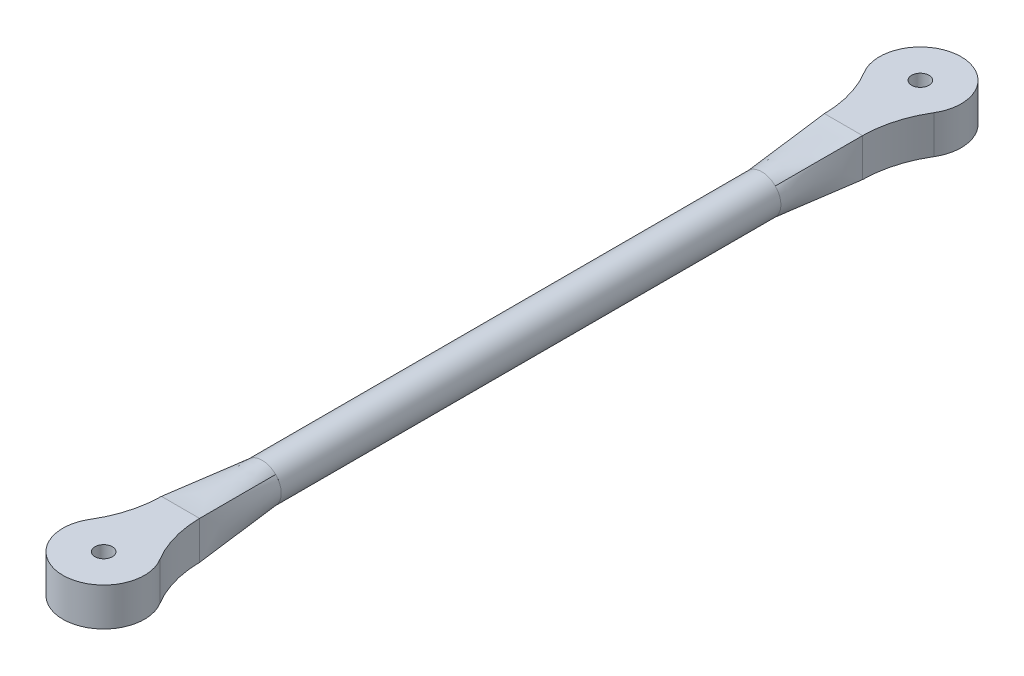
ISO-10303-21;
HEADER;
FILE_DESCRIPTION(('STEP AP214'),'2;1');
FILE_NAME('part.step','',(''),(''),'','','');
FILE_SCHEMA(('AUTOMOTIVE_DESIGN { 1 0 10303 214 1 1 1 1 }'));
ENDSEC;
DATA;
#1=APPLICATION_CONTEXT('core data for automotive mechanical design processes');
#2=APPLICATION_PROTOCOL_DEFINITION('international standard','automotive_design',2000,#1);
#3=PRODUCT_CONTEXT('',#1,'mechanical');
#4=PRODUCT('Part','Part','',(#3));
#5=PRODUCT_RELATED_PRODUCT_CATEGORY('part','',(#4));
#6=PRODUCT_DEFINITION_FORMATION('','',#4);
#7=PRODUCT_DEFINITION_CONTEXT('part definition',#1,'design');
#8=PRODUCT_DEFINITION('design','',#6,#7);
#9=PRODUCT_DEFINITION_SHAPE('','',#8);
#10=(LENGTH_UNIT() NAMED_UNIT(*) SI_UNIT(.MILLI.,.METRE.));
#11=(NAMED_UNIT(*) PLANE_ANGLE_UNIT() SI_UNIT($,.RADIAN.));
#12=(NAMED_UNIT(*) SI_UNIT($,.STERADIAN.) SOLID_ANGLE_UNIT());
#13=UNCERTAINTY_MEASURE_WITH_UNIT(LENGTH_MEASURE(1.E-05),#10,'distance_accuracy_value','');
#14=(GEOMETRIC_REPRESENTATION_CONTEXT(3) GLOBAL_UNCERTAINTY_ASSIGNED_CONTEXT((#13)) GLOBAL_UNIT_ASSIGNED_CONTEXT((#10,
#11,#12)) REPRESENTATION_CONTEXT('',''));
#15=CARTESIAN_POINT('',(0.,0.,0.));
#16=DIRECTION('',(0.,0.,1.));
#17=DIRECTION('',(1.,0.,0.));
#18=AXIS2_PLACEMENT_3D('',#15,#16,#17);
#19=CARTESIAN_POINT('',(0.,0.,50.));
#20=DIRECTION('',(0.,0.,-1.));
#21=DIRECTION('',(-1.,0.,0.));
#22=AXIS2_PLACEMENT_3D('',#19,#20,#21);
#23=CYLINDRICAL_SURFACE('',#22,3.5);
#24=CARTESIAN_POINT('',(0.,0.,45.8908481142394));
#25=DIRECTION('',(0.,0.,-1.));
#26=DIRECTION('',(-1.,0.,0.));
#27=AXIS2_PLACEMENT_3D('',#24,#25,#26);
#28=CIRCLE('',#27,3.5);
#29=CARTESIAN_POINT('',(-3.5,0.,45.8908481142394));
#30=VERTEX_POINT('',#29);
#31=EDGE_CURVE('E13',#30,#30,#28,.F.);
#32=ORIENTED_EDGE('',*,*,#31,.F.);
#33=EDGE_LOOP('',(#32));
#34=FACE_BOUND('',#33,.T.);
#35=CARTESIAN_POINT('',(2.47514039392341,-2.47460704564759,-45.8908481142394));
#36=CARTESIAN_POINT('',(2.18347373402961,-2.76633656801098,-45.8908481142395));
#37=CARTESIAN_POINT('',(1.81562078898366,-3.02791946362918,-45.8908481142394));
#38=CARTESIAN_POINT('',(0.965009462255433,-3.39610539668184,-45.8908481142394));
#39=CARTESIAN_POINT('',(0.483322797775339,-3.5,-45.8908481142395));
#40=CARTESIAN_POINT('',(-0.483322797775338,-3.5,-45.8908481142395));
#41=CARTESIAN_POINT('',(-0.965009462255431,-3.39610539668184,-45.8908481142395));
#42=CARTESIAN_POINT('',(-1.81562078898366,-3.02791946362918,-45.8908481142395));
#43=CARTESIAN_POINT('',(-2.18347373402961,-2.76633656801098,-45.8908481142395));
#44=CARTESIAN_POINT('',(-2.47514039392341,-2.47460704564759,-45.8908481142394));
#45=B_SPLINE_CURVE_WITH_KNOTS('',3,(#35,#36,#37,#38,#39,#40,#41,#42,#43,#44),.UNSPECIFIED.,.F.,
.F.,(4,2,2,2,4),(0.,0.25,0.5,0.75,1.),.UNSPECIFIED.);
#46=CARTESIAN_POINT('',(-2.47514042273913,-2.47460707447812,-45.8908481142394));
#47=VERTEX_POINT('',#46);
#48=CARTESIAN_POINT('',(2.47514039392341,-2.47460704564759,-45.8908481142394));
#49=VERTEX_POINT('',#48);
#50=EDGE_CURVE('E232',#47,#49,#45,.F.);
#51=ORIENTED_EDGE('',*,*,#50,.T.);
#52=CARTESIAN_POINT('',(0.,0.,-45.8908481142394));
#53=DIRECTION('',(0.,0.,-1.));
#54=DIRECTION('',(-1.,0.,0.));
#55=AXIS2_PLACEMENT_3D('',#52,#53,#54);
#56=CIRCLE('',#55,3.5);
#57=CARTESIAN_POINT('',(2.47514039392341,2.47460704564759,-45.8908481142394));
#58=VERTEX_POINT('',#57);
#59=EDGE_CURVE('E242',#58,#49,#56,.T.);
#60=ORIENTED_EDGE('',*,*,#59,.F.);
#61=CARTESIAN_POINT('',(-2.47514039392341,2.47460704564759,-45.8908481142394));
#62=VERTEX_POINT('',#61);
#63=EDGE_CURVE('E321',#62,#58,#56,.T.);
#64=ORIENTED_EDGE('',*,*,#63,.F.);
#65=EDGE_CURVE('E226',#47,#62,#56,.T.);
#66=ORIENTED_EDGE('',*,*,#65,.F.);
#67=EDGE_LOOP('',(#51,#60,#64,#66));
#68=FACE_BOUND('',#67,.T.);
#69=ADVANCED_FACE('F131',(#34,#68),#23,.T.);
#70=CARTESIAN_POINT('',(-2.47514039392341,2.47460704564759,-45.8908481142394));
#71=CARTESIAN_POINT('',(-3.50075434965266,3.5,-60.8908481142394));
#72=CARTESIAN_POINT('',(-2.18347373402961,2.76633656801098,-45.8908481142394));
#73=CARTESIAN_POINT('',(-2.91729529137722,3.5,-60.8908481142394));
#74=CARTESIAN_POINT('',(-1.81562078898366,3.02791946362918,-45.8908481142395));
#75=CARTESIAN_POINT('',(-2.33383623310177,3.5,-60.8908481142394));
#76=CARTESIAN_POINT('',(-0.965009462255432,3.39610539668184,-45.8908481142394));
#77=CARTESIAN_POINT('',(-1.16691811655089,3.5,-60.8908481142394));
#78=CARTESIAN_POINT('',(-0.483322797775338,3.5,-45.8908481142394));
#79=CARTESIAN_POINT('',(-0.583459058275443,3.5,-60.8908481142394));
#80=CARTESIAN_POINT('',(0.483322797775338,3.5,-45.8908481142395));
#81=CARTESIAN_POINT('',(0.583459058275444,3.5,-60.8908481142394));
#82=CARTESIAN_POINT('',(0.965009462255431,3.39610539668184,-45.8908481142394));
#83=CARTESIAN_POINT('',(1.16691811655089,3.5,-60.8908481142394));
#84=CARTESIAN_POINT('',(1.81562078898366,3.02791946362918,-45.8908481142395));
#85=CARTESIAN_POINT('',(2.33383623310178,3.5,-60.8908481142394));
#86=CARTESIAN_POINT('',(2.1834737340296,2.76633656801099,-45.8908481142394));
#87=CARTESIAN_POINT('',(2.91729529137722,3.5,-60.8908481142394));
#88=CARTESIAN_POINT('',(2.47514039392341,2.47460704564759,-45.8908481142394));
#89=CARTESIAN_POINT('',(3.50075434965266,3.5,-60.8908481142394));
#90=B_SPLINE_SURFACE_WITH_KNOTS('',3,1,((#70,#71),(#72,#73),(#74,#75),(#76,#77),(#78,#79),(#80,
#81),(#82,#83),(#84,#85),(#86,#87),(#88,#89)),.UNSPECIFIED.,.F.,.F.,.F.,(4,2,2,2,4),(2,2),(0.,
0.25,0.5,0.75,1.),(0.,1.),.UNSPECIFIED.);
#91=DIRECTION('',(0.0680569034764988,0.0680422384368041,-0.995358484003477));
#92=VECTOR('',#91,1.);
#93=CARTESIAN_POINT('',(2.98794737178803,2.98730352282379,-53.3908481142394));
#94=LINE('',#93,#92);
#95=CARTESIAN_POINT('',(3.50075434965266,3.5,-60.8908481142394));
#96=VERTEX_POINT('',#95);
#97=EDGE_CURVE('E318',#58,#96,#94,.T.);
#98=DIRECTION('',(-1.,0.,0.));
#99=VECTOR('',#98,1.);
#100=CARTESIAN_POINT('',(3.50075434965266,3.5,-60.8908481142394));
#101=LINE('',#100,#99);
#102=CARTESIAN_POINT('',(-3.50075434965266,3.5,-60.8908481142394));
#103=VERTEX_POINT('',#102);
#104=EDGE_CURVE('E320',#96,#103,#101,.T.);
#105=DIRECTION('',(0.0680569034764988,-0.0680422384368042,0.995358484003477));
#106=VECTOR('',#105,1.);
#107=CARTESIAN_POINT('',(-2.98794737178803,2.98730352282379,-53.3908481142394));
#108=LINE('',#107,#106);
#109=EDGE_CURVE('E225',#103,#62,#108,.T.);
#110=ORIENTED_EDGE('',*,*,#63,.T.);
#111=ORIENTED_EDGE('',*,*,#97,.T.);
#112=ORIENTED_EDGE('',*,*,#104,.T.);
#113=ORIENTED_EDGE('',*,*,#109,.T.);
#114=EDGE_LOOP('',(#110,#111,#112,#113));
#115=FACE_BOUND('',#114,.T.);
#116=ADVANCED_FACE('F326',(#115),#90,.T.);
#117=CARTESIAN_POINT('',(2.47514039392341,2.47460704564759,-45.8908481142394));
#118=CARTESIAN_POINT('',(3.50075434965266,3.5,-60.8908481142394));
#119=CARTESIAN_POINT('',(2.76674420489334,2.18294038575379,-45.8908481142395));
#120=CARTESIAN_POINT('',(3.50075434965266,2.91666666666667,-60.8908481142394));
#121=CARTESIAN_POINT('',(3.02819068787414,1.81513530449393,-45.8908481142395));
#122=CARTESIAN_POINT('',(3.50075434965266,2.33333333333333,-60.8908481142394));
#123=CARTESIAN_POINT('',(3.39617071487054,0.964717311549674,-45.8908481142394));
#124=CARTESIAN_POINT('',(3.50075434965266,1.16666666666667,-60.8908481142394));
#125=CARTESIAN_POINT('',(3.5,0.483175517715297,-45.8908481142395));
#126=CARTESIAN_POINT('',(3.50075434965266,0.583333333333335,-60.8908481142394));
#127=CARTESIAN_POINT('',(3.5,-0.483175517715295,-45.8908481142395));
#128=CARTESIAN_POINT('',(3.50075434965266,-0.583333333333332,-60.8908481142394));
#129=CARTESIAN_POINT('',(3.39617071487054,-0.964717311549672,-45.8908481142395));
#130=CARTESIAN_POINT('',(3.50075434965266,-1.16666666666667,-60.8908481142394));
#131=CARTESIAN_POINT('',(3.02819068787414,-1.81513530449392,-45.8908481142395));
#132=CARTESIAN_POINT('',(3.50075434965266,-2.33333333333333,-60.8908481142394));
#133=CARTESIAN_POINT('',(2.76674420489334,-2.18294038575379,-45.8908481142395));
#134=CARTESIAN_POINT('',(3.50075434965266,-2.91666666666667,-60.8908481142394));
#135=CARTESIAN_POINT('',(2.47514039392341,-2.47460704564759,-45.8908481142394));
#136=CARTESIAN_POINT('',(3.50075434965266,-3.5,-60.8908481142394));
#137=B_SPLINE_SURFACE_WITH_KNOTS('',3,1,((#117,#118),(#119,#120),(#121,#122),(#123,#124),(#125,
#126),(#127,#128),(#129,#130),(#131,#132),(#133,#134),(#135,#136)),.UNSPECIFIED.,.F.,.F.,.F.,(4,
2,2,2,4),(2,2),(0.,0.25,0.5,0.75,1.),(0.,1.),.UNSPECIFIED.);
#138=DIRECTION('',(0.0680569034764987,-0.0680422384368042,-0.995358484003477));
#139=VECTOR('',#138,1.);
#140=CARTESIAN_POINT('',(2.98794737178803,-2.98730352282379,-53.3908481142394));
#141=LINE('',#140,#139);
#142=CARTESIAN_POINT('',(3.50075434965266,-3.5,-60.8908481142394));
#143=VERTEX_POINT('',#142);
#144=EDGE_CURVE('E240',#49,#143,#141,.T.);
#145=DIRECTION('',(0.,1.,0.));
#146=VECTOR('',#145,1.);
#147=CARTESIAN_POINT('',(3.50075434965266,-3.5,-60.8908481142394));
#148=LINE('',#147,#146);
#149=EDGE_CURVE('E164',#143,#96,#148,.T.);
#150=ORIENTED_EDGE('',*,*,#59,.T.);
#151=ORIENTED_EDGE('',*,*,#144,.T.);
#152=ORIENTED_EDGE('',*,*,#149,.T.);
#153=ORIENTED_EDGE('',*,*,#97,.F.);
#154=EDGE_LOOP('',(#150,#151,#152,#153));
#155=FACE_BOUND('',#154,.T.);
#156=ADVANCED_FACE('F278',(#155),#137,.T.);
#157=CARTESIAN_POINT('',(-2.47514039392341,-2.47460704564759,-45.8908481142394));
#158=CARTESIAN_POINT('',(-3.50075434965266,-3.5,-60.8908481142394));
#159=CARTESIAN_POINT('',(-2.76674420489334,-2.18294038575379,-45.8908481142395));
#160=CARTESIAN_POINT('',(-3.50075434965266,-2.91666666666667,-60.8908481142394));
#161=CARTESIAN_POINT('',(-3.02819068787414,-1.81513530449393,-45.8908481142395));
#162=CARTESIAN_POINT('',(-3.50075434965266,-2.33333333333333,-60.8908481142394));
#163=CARTESIAN_POINT('',(-3.39617071487054,-0.964717311549673,-45.8908481142394));
#164=CARTESIAN_POINT('',(-3.50075434965266,-1.16666666666667,-60.8908481142394));
#165=CARTESIAN_POINT('',(-3.5,-0.483175517715296,-45.8908481142395));
#166=CARTESIAN_POINT('',(-3.50075434965266,-0.583333333333333,-60.8908481142394));
#167=CARTESIAN_POINT('',(-3.5,0.483175517715296,-45.8908481142395));
#168=CARTESIAN_POINT('',(-3.50075434965266,0.583333333333334,-60.8908481142394));
#169=CARTESIAN_POINT('',(-3.39617071487054,0.964717311549672,-45.8908481142395));
#170=CARTESIAN_POINT('',(-3.50075434965266,1.16666666666667,-60.8908481142394));
#171=CARTESIAN_POINT('',(-3.02819068787414,1.81513530449393,-45.8908481142395));
#172=CARTESIAN_POINT('',(-3.50075434965266,2.33333333333333,-60.8908481142394));
#173=CARTESIAN_POINT('',(-2.76674420489334,2.18294038575379,-45.8908481142395));
#174=CARTESIAN_POINT('',(-3.50075434965266,2.91666666666667,-60.8908481142394));
#175=CARTESIAN_POINT('',(-2.47514039392341,2.47460704564759,-45.8908481142394));
#176=CARTESIAN_POINT('',(-3.50075434965266,3.5,-60.8908481142394));
#177=B_SPLINE_SURFACE_WITH_KNOTS('',3,1,((#157,#158),(#159,#160),(#161,#162),(#163,#164),(#165,
#166),(#167,#168),(#169,#170),(#171,#172),(#173,#174),(#175,#176)),.UNSPECIFIED.,.F.,.F.,.F.,(4,
2,2,2,4),(2,2),(0.,0.25,0.5,0.75,1.),(0.,1.),.UNSPECIFIED.);
#178=DIRECTION('',(0.,-1.,0.));
#179=VECTOR('',#178,1.);
#180=CARTESIAN_POINT('',(-3.50075434965266,3.5,-60.8908481142394));
#181=LINE('',#180,#179);
#182=CARTESIAN_POINT('',(-3.50075434965266,-3.5,-60.8908481142394));
#183=VERTEX_POINT('',#182);
#184=EDGE_CURVE('E212',#103,#183,#181,.T.);
#185=DIRECTION('',(-0.0680569034764988,-0.0680422384368042,-0.995358484003477));
#186=VECTOR('',#185,1.);
#187=CARTESIAN_POINT('',(-2.98794737178803,-2.98730352282379,-53.3908481142394));
#188=LINE('',#187,#186);
#189=EDGE_CURVE('E205',#47,#183,#188,.T.);
#190=ORIENTED_EDGE('',*,*,#65,.T.);
#191=ORIENTED_EDGE('',*,*,#109,.F.);
#192=ORIENTED_EDGE('',*,*,#184,.T.);
#193=ORIENTED_EDGE('',*,*,#189,.F.);
#194=EDGE_LOOP('',(#190,#191,#192,#193));
#195=FACE_BOUND('',#194,.T.);
#196=ADVANCED_FACE('F222',(#195),#177,.T.);
#197=CARTESIAN_POINT('',(2.47514039392341,-2.47460704564759,-45.8908481142394));
#198=CARTESIAN_POINT('',(3.50075434965266,-3.5,-60.8908481142394));
#199=CARTESIAN_POINT('',(2.18347373402961,-2.76633656801098,-45.8908481142395));
#200=CARTESIAN_POINT('',(2.91729529137722,-3.5,-60.8908481142394));
#201=CARTESIAN_POINT('',(1.81562078898366,-3.02791946362918,-45.8908481142394));
#202=CARTESIAN_POINT('',(2.33383623310178,-3.5,-60.8908481142394));
#203=CARTESIAN_POINT('',(0.965009462255433,-3.39610539668184,-45.8908481142394));
#204=CARTESIAN_POINT('',(1.16691811655089,-3.5,-60.8908481142394));
#205=CARTESIAN_POINT('',(0.483322797775339,-3.5,-45.8908481142395));
#206=CARTESIAN_POINT('',(0.583459058275445,-3.5,-60.8908481142394));
#207=CARTESIAN_POINT('',(-0.483322797775338,-3.5,-45.8908481142395));
#208=CARTESIAN_POINT('',(-0.583459058275443,-3.5,-60.8908481142394));
#209=CARTESIAN_POINT('',(-0.965009462255431,-3.39610539668184,-45.8908481142395));
#210=CARTESIAN_POINT('',(-1.16691811655089,-3.5,-60.8908481142394));
#211=CARTESIAN_POINT('',(-1.81562078898366,-3.02791946362918,-45.8908481142395));
#212=CARTESIAN_POINT('',(-2.33383623310177,-3.5,-60.8908481142394));
#213=CARTESIAN_POINT('',(-2.18347373402961,-2.76633656801098,-45.8908481142395));
#214=CARTESIAN_POINT('',(-2.91729529137722,-3.5,-60.8908481142394));
#215=CARTESIAN_POINT('',(-2.47514039392341,-2.47460704564759,-45.8908481142394));
#216=CARTESIAN_POINT('',(-3.50075434965266,-3.5,-60.8908481142394));
#217=B_SPLINE_SURFACE_WITH_KNOTS('',3,1,((#197,#198),(#199,#200),(#201,#202),(#203,#204),(#205,
#206),(#207,#208),(#209,#210),(#211,#212),(#213,#214),(#215,#216)),.UNSPECIFIED.,.F.,.F.,.F.,(4,
2,2,2,4),(2,2),(0.,0.25,0.5,0.75,1.),(0.,1.),.UNSPECIFIED.);
#218=DIRECTION('',(1.,0.,0.));
#219=VECTOR('',#218,1.);
#220=CARTESIAN_POINT('',(-3.50075434965266,-3.5,-60.8908481142394));
#221=LINE('',#220,#219);
#222=EDGE_CURVE('E193',#183,#143,#221,.T.);
#223=ORIENTED_EDGE('',*,*,#50,.F.);
#224=ORIENTED_EDGE('',*,*,#189,.T.);
#225=ORIENTED_EDGE('',*,*,#222,.T.);
#226=ORIENTED_EDGE('',*,*,#144,.F.);
#227=EDGE_LOOP('',(#223,#224,#225,#226));
#228=FACE_BOUND('',#227,.T.);
#229=ADVANCED_FACE('F230',(#228),#217,.T.);
#230=CARTESIAN_POINT('',(0.,3.5,-75.));
#231=DIRECTION('',(0.,-1.,0.));
#232=DIRECTION('',(0.,0.,-1.));
#233=AXIS2_PLACEMENT_3D('',#230,#231,#232);
#234=CYLINDRICAL_SURFACE('',#233,1.6);
#235=CARTESIAN_POINT('',(0.,3.5,-75.));
#236=DIRECTION('',(0.,1.,0.));
#237=DIRECTION('',(0.,0.,1.));
#238=AXIS2_PLACEMENT_3D('',#235,#236,#237);
#239=CIRCLE('',#238,1.6);
#240=CARTESIAN_POINT('',(0.,3.5,-73.4));
#241=VERTEX_POINT('',#240);
#242=EDGE_CURVE('E204',#241,#241,#239,.T.);
#243=ORIENTED_EDGE('',*,*,#242,.T.);
#244=EDGE_LOOP('',(#243));
#245=FACE_BOUND('',#244,.T.);
#246=CARTESIAN_POINT('',(0.,-3.5,-75.));
#247=DIRECTION('',(0.,1.,0.));
#248=DIRECTION('',(0.,0.,1.));
#249=AXIS2_PLACEMENT_3D('',#246,#247,#248);
#250=CIRCLE('',#249,1.6);
#251=CARTESIAN_POINT('',(0.,-3.5,-73.4));
#252=VERTEX_POINT('',#251);
#253=EDGE_CURVE('E216',#252,#252,#250,.T.);
#254=ORIENTED_EDGE('',*,*,#253,.F.);
#255=EDGE_LOOP('',(#254));
#256=FACE_BOUND('',#255,.T.);
#257=ADVANCED_FACE('F258',(#245,#256),#234,.F.);
#258=CARTESIAN_POINT('',(0.,3.5,-75.));
#259=DIRECTION('',(0.,-1.,0.));
#260=DIRECTION('',(0.,0.,-1.));
#261=AXIS2_PLACEMENT_3D('',#258,#259,#260);
#262=CYLINDRICAL_SURFACE('',#261,7.5);
#263=CARTESIAN_POINT('',(0.,-3.5,-75.));
#264=DIRECTION('',(0.,1.,0.));
#265=DIRECTION('',(0.,0.,-1.));
#266=AXIS2_PLACEMENT_3D('',#263,#264,#265);
#267=CIRCLE('',#266,7.5);
#268=CARTESIAN_POINT('',(6.40909090909091,-3.5,-71.104675402613));
#269=VERTEX_POINT('',#268);
#270=CARTESIAN_POINT('',(-6.40909090909091,-3.5,-71.104675402613));
#271=VERTEX_POINT('',#270);
#272=EDGE_CURVE('E172',#269,#271,#267,.T.);
#273=ORIENTED_EDGE('',*,*,#272,.T.);
#274=DIRECTION('',(0.,-1.,0.));
#275=VECTOR('',#274,1.);
#276=CARTESIAN_POINT('',(-6.40909090909091,3.5,-71.104675402613));
#277=LINE('',#276,#275);
#278=CARTESIAN_POINT('',(-6.40909090909091,3.5,-71.104675402613));
#279=VERTEX_POINT('',#278);
#280=EDGE_CURVE('E215',#279,#271,#277,.T.);
#281=ORIENTED_EDGE('',*,*,#280,.F.);
#282=CARTESIAN_POINT('',(0.,3.5,-75.));
#283=DIRECTION('',(0.,1.,0.));
#284=DIRECTION('',(0.,0.,-1.));
#285=AXIS2_PLACEMENT_3D('',#282,#283,#284);
#286=CIRCLE('',#285,7.5);
#287=CARTESIAN_POINT('',(6.40909090909091,3.5,-71.104675402613));
#288=VERTEX_POINT('',#287);
#289=EDGE_CURVE('E140',#288,#279,#286,.T.);
#290=ORIENTED_EDGE('',*,*,#289,.F.);
#291=DIRECTION('',(0.,-1.,0.));
#292=VECTOR('',#291,1.);
#293=CARTESIAN_POINT('',(6.40909090909091,3.5,-71.104675402613));
#294=LINE('',#293,#292);
#295=EDGE_CURVE('E410',#288,#269,#294,.T.);
#296=ORIENTED_EDGE('',*,*,#295,.T.);
#297=EDGE_LOOP('',(#273,#281,#290,#296));
#298=FACE_BOUND('',#297,.T.);
#299=ADVANCED_FACE('F456',(#298),#262,.T.);
#300=CARTESIAN_POINT('',(23.5,3.5,-60.7171431429143));
#301=DIRECTION('',(0.,-1.,0.));
#302=DIRECTION('',(0.,0.,-1.));
#303=AXIS2_PLACEMENT_3D('',#300,#301,#302);
#304=CYLINDRICAL_SURFACE('',#303,20.);
#305=ORIENTED_EDGE('',*,*,#149,.F.);
#306=CARTESIAN_POINT('',(23.5,-3.5,-60.7171431429143));
#307=DIRECTION('',(0.,-1.,0.));
#308=DIRECTION('',(0.,0.,1.));
#309=AXIS2_PLACEMENT_3D('',#306,#307,#308);
#310=CIRCLE('',#309,20.);
#311=EDGE_CURVE('E198',#143,#269,#310,.T.);
#312=ORIENTED_EDGE('',*,*,#311,.T.);
#313=ORIENTED_EDGE('',*,*,#295,.F.);
#314=CARTESIAN_POINT('',(23.5,3.5,-60.7171431429143));
#315=DIRECTION('',(0.,-1.,0.));
#316=DIRECTION('',(0.,0.,1.));
#317=AXIS2_PLACEMENT_3D('',#314,#315,#316);
#318=CIRCLE('',#317,20.);
#319=EDGE_CURVE('E395',#96,#288,#318,.T.);
#320=ORIENTED_EDGE('',*,*,#319,.F.);
#321=EDGE_LOOP('',(#305,#312,#313,#320));
#322=FACE_BOUND('',#321,.T.);
#323=ADVANCED_FACE('F338',(#322),#304,.F.);
#324=CARTESIAN_POINT('',(-23.5,3.5,-60.7171431429143));
#325=DIRECTION('',(0.,-1.,0.));
#326=DIRECTION('',(0.,0.,-1.));
#327=AXIS2_PLACEMENT_3D('',#324,#325,#326);
#328=CYLINDRICAL_SURFACE('',#327,20.);
#329=ORIENTED_EDGE('',*,*,#184,.F.);
#330=CARTESIAN_POINT('',(-23.5,3.5,-60.7171431429143));
#331=DIRECTION('',(0.,-1.,0.));
#332=DIRECTION('',(0.,0.,1.));
#333=AXIS2_PLACEMENT_3D('',#330,#331,#332);
#334=CIRCLE('',#333,20.);
#335=EDGE_CURVE('E187',#279,#103,#334,.T.);
#336=ORIENTED_EDGE('',*,*,#335,.F.);
#337=ORIENTED_EDGE('',*,*,#280,.T.);
#338=CARTESIAN_POINT('',(-23.5,-3.5,-60.7171431429143));
#339=DIRECTION('',(0.,-1.,0.));
#340=DIRECTION('',(0.,0.,1.));
#341=AXIS2_PLACEMENT_3D('',#338,#339,#340);
#342=CIRCLE('',#341,20.);
#343=EDGE_CURVE('E197',#271,#183,#342,.T.);
#344=ORIENTED_EDGE('',*,*,#343,.T.);
#345=EDGE_LOOP('',(#329,#336,#337,#344));
#346=FACE_BOUND('',#345,.T.);
#347=ADVANCED_FACE('F211',(#346),#328,.F.);
#348=CARTESIAN_POINT('',(23.5,-3.5,-60.7171431429143));
#349=DIRECTION('',(0.,1.,0.));
#350=DIRECTION('',(0.,0.,1.));
#351=AXIS2_PLACEMENT_3D('',#348,#349,#350);
#352=PLANE('',#351);
#353=ORIENTED_EDGE('',*,*,#253,.T.);
#354=EDGE_LOOP('',(#353));
#355=FACE_BOUND('',#354,.T.);
#356=ORIENTED_EDGE('',*,*,#222,.F.);
#357=ORIENTED_EDGE('',*,*,#343,.F.);
#358=ORIENTED_EDGE('',*,*,#272,.F.);
#359=ORIENTED_EDGE('',*,*,#311,.F.);
#360=EDGE_LOOP('',(#356,#357,#358,#359));
#361=FACE_BOUND('',#360,.T.);
#362=ADVANCED_FACE('F196',(#355,#361),#352,.F.);
#363=CARTESIAN_POINT('',(23.5,3.5,-60.7171431429143));
#364=DIRECTION('',(0.,1.,0.));
#365=DIRECTION('',(0.,0.,1.));
#366=AXIS2_PLACEMENT_3D('',#363,#364,#365);
#367=PLANE('',#366);
#368=ORIENTED_EDGE('',*,*,#242,.F.);
#369=EDGE_LOOP('',(#368));
#370=FACE_BOUND('',#369,.T.);
#371=ORIENTED_EDGE('',*,*,#335,.T.);
#372=ORIENTED_EDGE('',*,*,#104,.F.);
#373=ORIENTED_EDGE('',*,*,#319,.T.);
#374=ORIENTED_EDGE('',*,*,#289,.T.);
#375=EDGE_LOOP('',(#371,#372,#373,#374));
#376=FACE_BOUND('',#375,.T.);
#377=ADVANCED_FACE('F384',(#370,#376),#367,.T.);
#378=CARTESIAN_POINT('',(-9.02207098454915,3.551,45.8908481142394));
#379=DIRECTION('',(0.,0.,-1.));
#380=DIRECTION('',(-1.,0.,0.));
#381=AXIS2_PLACEMENT_3D('',#378,#379,#380);
#382=PLANE('',#381);
#383=ORIENTED_EDGE('',*,*,#31,.T.);
#384=EDGE_LOOP('',(#383));
#385=FACE_BOUND('',#384,.T.);
#386=ADVANCED_FACE('F133',(#385),#382,.F.);
#387=CLOSED_SHELL('',(#69,#116,#156,#196,#229,#257,#299,#323,#347,#362,#377,#386));
#388=MANIFOLD_SOLID_BREP('B2',#387);
#389=CARTESIAN_POINT('',(0.,3.5,75.));
#390=DIRECTION('',(0.,-1.,0.));
#391=DIRECTION('',(0.,0.,-1.));
#392=AXIS2_PLACEMENT_3D('',#389,#390,#391);
#393=CYLINDRICAL_SURFACE('',#392,1.6);
#394=CARTESIAN_POINT('',(0.,3.5,75.));
#395=DIRECTION('',(0.,1.,0.));
#396=DIRECTION('',(0.,0.,1.));
#397=AXIS2_PLACEMENT_3D('',#394,#395,#396);
#398=CIRCLE('',#397,1.6);
#399=CARTESIAN_POINT('',(0.,3.5,76.6));
#400=VERTEX_POINT('',#399);
#401=EDGE_CURVE('E129',#400,#400,#398,.T.);
#402=ORIENTED_EDGE('',*,*,#401,.T.);
#403=EDGE_LOOP('',(#402));
#404=FACE_BOUND('',#403,.T.);
#405=CARTESIAN_POINT('',(0.,-3.5,75.));
#406=DIRECTION('',(0.,1.,0.));
#407=DIRECTION('',(0.,0.,1.));
#408=AXIS2_PLACEMENT_3D('',#405,#406,#407);
#409=CIRCLE('',#408,1.6);
#410=CARTESIAN_POINT('',(0.,-3.5,76.6));
#411=VERTEX_POINT('',#410);
#412=EDGE_CURVE('E831',#411,#411,#409,.T.);
#413=ORIENTED_EDGE('',*,*,#412,.F.);
#414=EDGE_LOOP('',(#413));
#415=FACE_BOUND('',#414,.T.);
#416=ADVANCED_FACE('F564',(#404,#415),#393,.F.);
#417=CARTESIAN_POINT('',(0.,3.5,75.));
#418=DIRECTION('',(0.,-1.,0.));
#419=DIRECTION('',(0.,0.,-1.));
#420=AXIS2_PLACEMENT_3D('',#417,#418,#419);
#421=CYLINDRICAL_SURFACE('',#420,7.5);
#422=CARTESIAN_POINT('',(0.,-3.5,75.));
#423=DIRECTION('',(0.,1.,0.));
#424=DIRECTION('',(0.,0.,1.));
#425=AXIS2_PLACEMENT_3D('',#422,#423,#424);
#426=CIRCLE('',#425,7.5);
#427=CARTESIAN_POINT('',(-6.40909090909091,-3.5,71.104675402613));
#428=VERTEX_POINT('',#427);
#429=CARTESIAN_POINT('',(6.40909090909091,-3.5,71.104675402613));
#430=VERTEX_POINT('',#429);
#431=EDGE_CURVE('E592',#428,#430,#426,.T.);
#432=ORIENTED_EDGE('',*,*,#431,.T.);
#433=DIRECTION('',(0.,-1.,0.));
#434=VECTOR('',#433,1.);
#435=CARTESIAN_POINT('',(6.40909090909091,3.5,71.104675402613));
#436=LINE('',#435,#434);
#437=CARTESIAN_POINT('',(6.40909090909091,3.5,71.104675402613));
#438=VERTEX_POINT('',#437);
#439=EDGE_CURVE('E574',#438,#430,#436,.T.);
#440=ORIENTED_EDGE('',*,*,#439,.F.);
#441=CARTESIAN_POINT('',(0.,3.5,75.));
#442=DIRECTION('',(0.,1.,0.));
#443=DIRECTION('',(0.,0.,1.));
#444=AXIS2_PLACEMENT_3D('',#441,#442,#443);
#445=CIRCLE('',#444,7.5);
#446=CARTESIAN_POINT('',(-6.40909090909091,3.5,71.104675402613));
#447=VERTEX_POINT('',#446);
#448=EDGE_CURVE('E813',#447,#438,#445,.T.);
#449=ORIENTED_EDGE('',*,*,#448,.F.);
#450=DIRECTION('',(0.,-1.,0.));
#451=VECTOR('',#450,1.);
#452=CARTESIAN_POINT('',(-6.40909090909091,3.5,71.104675402613));
#453=LINE('',#452,#451);
#454=EDGE_CURVE('E824',#447,#428,#453,.T.);
#455=ORIENTED_EDGE('',*,*,#454,.T.);
#456=EDGE_LOOP('',(#432,#440,#449,#455));
#457=FACE_BOUND('',#456,.T.);
#458=ADVANCED_FACE('F828',(#457),#421,.T.);
#459=CARTESIAN_POINT('',(-23.5,3.5,60.7171431429143));
#460=DIRECTION('',(0.,-1.,0.));
#461=DIRECTION('',(0.,0.,-1.));
#462=AXIS2_PLACEMENT_3D('',#459,#460,#461);
#463=CYLINDRICAL_SURFACE('',#462,20.);
#464=CARTESIAN_POINT('',(-23.5,3.5,60.7171431429143));
#465=DIRECTION('',(0.,-1.,0.));
#466=DIRECTION('',(0.,0.,-1.));
#467=AXIS2_PLACEMENT_3D('',#464,#465,#466);
#468=CIRCLE('',#467,20.);
#469=CARTESIAN_POINT('',(-3.50075434965266,3.5,60.8908481142394));
#470=VERTEX_POINT('',#469);
#471=EDGE_CURVE('E607',#470,#447,#468,.T.);
#472=ORIENTED_EDGE('',*,*,#471,.F.);
#473=CARTESIAN_POINT('',(-3.50075434965266,-3.5,60.8908481142394));
#474=CARTESIAN_POINT('',(-3.50075434965266,-2.91666666666667,60.8908481142394));
#475=CARTESIAN_POINT('',(-3.50075434965266,-2.33333333333333,60.8908481142394));
#476=CARTESIAN_POINT('',(-3.50075434965266,-1.16666666666667,60.8908481142394));
#477=CARTESIAN_POINT('',(-3.50075434965266,-0.583333333333333,60.8908481142394));
#478=CARTESIAN_POINT('',(-3.50075434965266,0.583333333333334,60.8908481142394));
#479=CARTESIAN_POINT('',(-3.50075434965266,1.16666666666667,60.8908481142394));
#480=CARTESIAN_POINT('',(-3.50075434965266,2.33333333333333,60.8908481142394));
#481=CARTESIAN_POINT('',(-3.50075434965266,2.91666666666667,60.8908481142394));
#482=CARTESIAN_POINT('',(-3.50075434965266,3.5,60.8908481142394));
#483=B_SPLINE_CURVE_WITH_KNOTS('',3,(#473,#474,#475,#476,#477,#478,#479,#480,#481,#482),
.UNSPECIFIED.,.F.,.F.,(4,2,2,2,4),(0.,0.25,0.5,0.75,1.),.UNSPECIFIED.);
#484=CARTESIAN_POINT('',(-3.50075434965266,-3.5,60.8908481142394));
#485=VERTEX_POINT('',#484);
#486=EDGE_CURVE('E712',#485,#470,#483,.T.);
#487=ORIENTED_EDGE('',*,*,#486,.F.);
#488=CARTESIAN_POINT('',(-23.5,-3.5,60.7171431429143));
#489=DIRECTION('',(0.,-1.,0.));
#490=DIRECTION('',(0.,0.,-1.));
#491=AXIS2_PLACEMENT_3D('',#488,#489,#490);
#492=CIRCLE('',#491,20.);
#493=EDGE_CURVE('E823',#485,#428,#492,.T.);
#494=ORIENTED_EDGE('',*,*,#493,.T.);
#495=ORIENTED_EDGE('',*,*,#454,.F.);
#496=EDGE_LOOP('',(#472,#487,#494,#495));
#497=FACE_BOUND('',#496,.T.);
#498=ADVANCED_FACE('F688',(#497),#463,.F.);
#499=CARTESIAN_POINT('',(23.5,3.5,60.7171431429143));
#500=DIRECTION('',(0.,-1.,0.));
#501=DIRECTION('',(0.,0.,-1.));
#502=AXIS2_PLACEMENT_3D('',#499,#500,#501);
#503=CYLINDRICAL_SURFACE('',#502,20.);
#504=CARTESIAN_POINT('',(23.5,-3.5,60.7171431429143));
#505=DIRECTION('',(0.,-1.,0.));
#506=DIRECTION('',(0.,0.,-1.));
#507=AXIS2_PLACEMENT_3D('',#504,#505,#506);
#508=CIRCLE('',#507,20.);
#509=CARTESIAN_POINT('',(3.50075434965266,-3.5,60.8908481142394));
#510=VERTEX_POINT('',#509);
#511=EDGE_CURVE('E826',#430,#510,#508,.T.);
#512=ORIENTED_EDGE('',*,*,#511,.T.);
#513=CARTESIAN_POINT('',(3.50075434965266,3.5,60.8908481142394));
#514=CARTESIAN_POINT('',(3.50075434965266,2.91666666666667,60.8908481142394));
#515=CARTESIAN_POINT('',(3.50075434965266,2.33333333333333,60.8908481142394));
#516=CARTESIAN_POINT('',(3.50075434965266,1.16666666666667,60.8908481142394));
#517=CARTESIAN_POINT('',(3.50075434965266,0.583333333333335,60.8908481142394));
#518=CARTESIAN_POINT('',(3.50075434965266,-0.583333333333332,60.8908481142394));
#519=CARTESIAN_POINT('',(3.50075434965266,-1.16666666666667,60.8908481142394));
#520=CARTESIAN_POINT('',(3.50075434965266,-2.33333333333333,60.8908481142394));
#521=CARTESIAN_POINT('',(3.50075434965266,-2.91666666666667,60.8908481142394));
#522=CARTESIAN_POINT('',(3.50075434965266,-3.5,60.8908481142394));
#523=B_SPLINE_CURVE_WITH_KNOTS('',3,(#513,#514,#515,#516,#517,#518,#519,#520,#521,#522),
.UNSPECIFIED.,.F.,.F.,(4,2,2,2,4),(0.,0.25,0.5,0.75,1.),.UNSPECIFIED.);
#524=CARTESIAN_POINT('',(3.50075434965266,3.5,60.8908481142394));
#525=VERTEX_POINT('',#524);
#526=EDGE_CURVE('E582',#525,#510,#523,.T.);
#527=ORIENTED_EDGE('',*,*,#526,.F.);
#528=CARTESIAN_POINT('',(23.5,3.5,60.7171431429143));
#529=DIRECTION('',(0.,-1.,0.));
#530=DIRECTION('',(0.,0.,-1.));
#531=AXIS2_PLACEMENT_3D('',#528,#529,#530);
#532=CIRCLE('',#531,20.);
#533=EDGE_CURVE('E815',#438,#525,#532,.T.);
#534=ORIENTED_EDGE('',*,*,#533,.F.);
#535=ORIENTED_EDGE('',*,*,#439,.T.);
#536=EDGE_LOOP('',(#512,#527,#534,#535));
#537=FACE_BOUND('',#536,.T.);
#538=ADVANCED_FACE('F842',(#537),#503,.F.);
#539=CARTESIAN_POINT('',(23.5,-3.5,60.7171431429143));
#540=DIRECTION('',(0.,-1.,0.));
#541=DIRECTION('',(0.,0.,-1.));
#542=AXIS2_PLACEMENT_3D('',#539,#540,#541);
#543=PLANE('',#542);
#544=CARTESIAN_POINT('',(3.50075434965266,-3.5,60.8908481142394));
#545=CARTESIAN_POINT('',(2.91729529137722,-3.5,60.8908481142394));
#546=CARTESIAN_POINT('',(2.33383623310178,-3.5,60.8908481142394));
#547=CARTESIAN_POINT('',(1.16691811655089,-3.5,60.8908481142394));
#548=CARTESIAN_POINT('',(0.583459058275445,-3.5,60.8908481142394));
#549=CARTESIAN_POINT('',(-0.583459058275443,-3.5,60.8908481142394));
#550=CARTESIAN_POINT('',(-1.16691811655089,-3.5,60.8908481142394));
#551=CARTESIAN_POINT('',(-2.33383623310177,-3.5,60.8908481142394));
#552=CARTESIAN_POINT('',(-2.91729529137722,-3.5,60.8908481142394));
#553=CARTESIAN_POINT('',(-3.50075434965266,-3.5,60.8908481142394));
#554=B_SPLINE_CURVE_WITH_KNOTS('',3,(#544,#545,#546,#547,#548,#549,#550,#551,#552,#553),
.UNSPECIFIED.,.F.,.F.,(4,2,2,2,4),(0.,0.25,0.5,0.75,1.),.UNSPECIFIED.);
#555=EDGE_CURVE('E619',#510,#485,#554,.T.);
#556=ORIENTED_EDGE('',*,*,#555,.F.);
#557=ORIENTED_EDGE('',*,*,#511,.F.);
#558=ORIENTED_EDGE('',*,*,#431,.F.);
#559=ORIENTED_EDGE('',*,*,#493,.F.);
#560=EDGE_LOOP('',(#556,#557,#558,#559));
#561=FACE_BOUND('',#560,.T.);
#562=ORIENTED_EDGE('',*,*,#412,.T.);
#563=EDGE_LOOP('',(#562));
#564=FACE_BOUND('',#563,.T.);
#565=ADVANCED_FACE('F851',(#561,#564),#543,.T.);
#566=CARTESIAN_POINT('',(23.5,3.5,60.7171431429143));
#567=DIRECTION('',(0.,-1.,0.));
#568=DIRECTION('',(0.,0.,-1.));
#569=AXIS2_PLACEMENT_3D('',#566,#567,#568);
#570=PLANE('',#569);
#571=ORIENTED_EDGE('',*,*,#533,.T.);
#572=CARTESIAN_POINT('',(-3.50075434965266,3.5,60.8908481142394));
#573=CARTESIAN_POINT('',(-2.91729529137722,3.5,60.8908481142394));
#574=CARTESIAN_POINT('',(-2.33383623310177,3.5,60.8908481142394));
#575=CARTESIAN_POINT('',(-1.16691811655089,3.5,60.8908481142394));
#576=CARTESIAN_POINT('',(-0.583459058275443,3.5,60.8908481142394));
#577=CARTESIAN_POINT('',(0.583459058275444,3.5,60.8908481142394));
#578=CARTESIAN_POINT('',(1.16691811655089,3.5,60.8908481142394));
#579=CARTESIAN_POINT('',(2.33383623310178,3.5,60.8908481142394));
#580=CARTESIAN_POINT('',(2.91729529137722,3.5,60.8908481142394));
#581=CARTESIAN_POINT('',(3.50075434965266,3.5,60.8908481142394));
#582=B_SPLINE_CURVE_WITH_KNOTS('',3,(#572,#573,#574,#575,#576,#577,#578,#579,#580,#581),
.UNSPECIFIED.,.F.,.F.,(4,2,2,2,4),(0.,0.25,0.5,0.75,1.),.UNSPECIFIED.);
#583=EDGE_CURVE('E611',#470,#525,#582,.T.);
#584=ORIENTED_EDGE('',*,*,#583,.F.);
#585=ORIENTED_EDGE('',*,*,#471,.T.);
#586=ORIENTED_EDGE('',*,*,#448,.T.);
#587=EDGE_LOOP('',(#571,#584,#585,#586));
#588=FACE_BOUND('',#587,.T.);
#589=ORIENTED_EDGE('',*,*,#401,.F.);
#590=EDGE_LOOP('',(#589));
#591=FACE_BOUND('',#590,.T.);
#592=ADVANCED_FACE('F829',(#588,#591),#570,.F.);
#593=CARTESIAN_POINT('',(0.,0.,45.8908481142394));
#594=DIRECTION('',(0.,0.,1.));
#595=DIRECTION('',(-1.,0.,0.));
#596=AXIS2_PLACEMENT_3D('',#593,#594,#595);
#597=PLANE('',#596);
#598=CARTESIAN_POINT('',(-2.47514039392341,-2.47460704564759,45.8908481142394));
#599=CARTESIAN_POINT('',(-2.18347373402961,-2.76633656801098,45.8908481142395));
#600=CARTESIAN_POINT('',(-1.81562078898366,-3.02791946362918,45.8908481142395));
#601=CARTESIAN_POINT('',(-0.965009462255431,-3.39610539668184,45.8908481142395));
#602=CARTESIAN_POINT('',(-0.483322797775338,-3.5,45.8908481142395));
#603=CARTESIAN_POINT('',(0.483322797775339,-3.5,45.8908481142395));
#604=CARTESIAN_POINT('',(0.965009462255433,-3.39610539668184,45.8908481142394));
#605=CARTESIAN_POINT('',(1.81562078898366,-3.02791946362918,45.8908481142394));
#606=CARTESIAN_POINT('',(2.18347373402961,-2.76633656801098,45.8908481142395));
#607=CARTESIAN_POINT('',(2.47514039392341,-2.47460704564759,45.8908481142394));
#608=B_SPLINE_CURVE_WITH_KNOTS('',3,(#598,#599,#600,#601,#602,#603,#604,#605,#606,#607),
.UNSPECIFIED.,.F.,.F.,(4,2,2,2,4),(0.,0.25,0.5,0.75,1.),.UNSPECIFIED.);
#609=CARTESIAN_POINT('',(2.47514039392341,-2.47460704564759,45.8908481142394));
#610=VERTEX_POINT('',#609);
#611=CARTESIAN_POINT('',(-2.47514039392341,-2.47460704564759,45.8908481142394));
#612=VERTEX_POINT('',#611);
#613=EDGE_CURVE('E655',#610,#612,#608,.F.);
#614=ORIENTED_EDGE('',*,*,#613,.T.);
#615=CARTESIAN_POINT('',(-2.47514039392341,2.47460704564759,45.8908481142394));
#616=CARTESIAN_POINT('',(-2.76674420489334,2.18294038575379,45.8908481142395));
#617=CARTESIAN_POINT('',(-3.02819068787414,1.81513530449393,45.8908481142395));
#618=CARTESIAN_POINT('',(-3.39617071487054,0.964717311549672,45.8908481142395));
#619=CARTESIAN_POINT('',(-3.5,0.483175517715296,45.8908481142395));
#620=CARTESIAN_POINT('',(-3.5,-0.483175517715296,45.8908481142395));
#621=CARTESIAN_POINT('',(-3.39617071487054,-0.964717311549673,45.8908481142394));
#622=CARTESIAN_POINT('',(-3.02819068787414,-1.81513530449393,45.8908481142395));
#623=CARTESIAN_POINT('',(-2.76674420489334,-2.18294038575379,45.8908481142395));
#624=CARTESIAN_POINT('',(-2.47514039392341,-2.47460704564759,45.8908481142394));
#625=B_SPLINE_CURVE_WITH_KNOTS('',3,(#615,#616,#617,#618,#619,#620,#621,#622,#623,#624),
.UNSPECIFIED.,.F.,.F.,(4,2,2,2,4),(0.,0.25,0.5,0.75,1.),.UNSPECIFIED.);
#626=CARTESIAN_POINT('',(-2.47514039392341,2.47460704564759,45.8908481142394));
#627=VERTEX_POINT('',#626);
#628=EDGE_CURVE('E667',#612,#627,#625,.F.);
#629=ORIENTED_EDGE('',*,*,#628,.T.);
#630=CARTESIAN_POINT('',(2.47514039392341,2.47460704564759,45.8908481142394));
#631=CARTESIAN_POINT('',(2.1834737340296,2.76633656801099,45.8908481142394));
#632=CARTESIAN_POINT('',(1.81562078898366,3.02791946362918,45.8908481142395));
#633=CARTESIAN_POINT('',(0.965009462255431,3.39610539668184,45.8908481142394));
#634=CARTESIAN_POINT('',(0.483322797775338,3.5,45.8908481142395));
#635=CARTESIAN_POINT('',(-0.483322797775338,3.5,45.8908481142394));
#636=CARTESIAN_POINT('',(-0.965009462255432,3.39610539668184,45.8908481142394));
#637=CARTESIAN_POINT('',(-1.81562078898366,3.02791946362918,45.8908481142395));
#638=CARTESIAN_POINT('',(-2.18347373402961,2.76633656801098,45.8908481142394));
#639=CARTESIAN_POINT('',(-2.47514039392341,2.47460704564759,45.8908481142394));
#640=B_SPLINE_CURVE_WITH_KNOTS('',3,(#630,#631,#632,#633,#634,#635,#636,#637,#638,#639),
.UNSPECIFIED.,.F.,.F.,(4,2,2,2,4),(0.,0.25,0.5,0.75,1.),.UNSPECIFIED.);
#641=CARTESIAN_POINT('',(2.47514039392341,2.47460704564759,45.8908481142394));
#642=VERTEX_POINT('',#641);
#643=EDGE_CURVE('E658',#627,#642,#640,.F.);
#644=ORIENTED_EDGE('',*,*,#643,.T.);
#645=CARTESIAN_POINT('',(2.47514039392341,-2.47460704564759,45.8908481142394));
#646=CARTESIAN_POINT('',(2.76674420489334,-2.18294038575379,45.8908481142395));
#647=CARTESIAN_POINT('',(3.02819068787414,-1.81513530449392,45.8908481142395));
#648=CARTESIAN_POINT('',(3.39617071487054,-0.964717311549672,45.8908481142395));
#649=CARTESIAN_POINT('',(3.5,-0.483175517715295,45.8908481142395));
#650=CARTESIAN_POINT('',(3.5,0.483175517715297,45.8908481142395));
#651=CARTESIAN_POINT('',(3.39617071487054,0.964717311549674,45.8908481142394));
#652=CARTESIAN_POINT('',(3.02819068787414,1.81513530449393,45.8908481142395));
#653=CARTESIAN_POINT('',(2.76674420489334,2.18294038575379,45.8908481142395));
#654=CARTESIAN_POINT('',(2.47514039392341,2.47460704564759,45.8908481142394));
#655=B_SPLINE_CURVE_WITH_KNOTS('',3,(#645,#646,#647,#648,#649,#650,#651,#652,#653,#654),
.UNSPECIFIED.,.F.,.F.,(4,2,2,2,4),(0.,0.25,0.5,0.75,1.),.UNSPECIFIED.);
#656=EDGE_CURVE('E641',#642,#610,#655,.F.);
#657=ORIENTED_EDGE('',*,*,#656,.T.);
#658=EDGE_LOOP('',(#614,#629,#644,#657));
#659=FACE_BOUND('',#658,.T.);
#660=ADVANCED_FACE('F653',(#659),#597,.F.);
#661=CARTESIAN_POINT('',(-2.47514039392341,2.47460704564759,45.8908481142394));
#662=CARTESIAN_POINT('',(-3.50075434965266,3.5,60.8908481142394));
#663=CARTESIAN_POINT('',(-2.18347373402961,2.76633656801098,45.8908481142394));
#664=CARTESIAN_POINT('',(-2.91729529137722,3.5,60.8908481142394));
#665=CARTESIAN_POINT('',(-1.81562078898366,3.02791946362918,45.8908481142395));
#666=CARTESIAN_POINT('',(-2.33383623310177,3.5,60.8908481142394));
#667=CARTESIAN_POINT('',(-0.965009462255432,3.39610539668184,45.8908481142394));
#668=CARTESIAN_POINT('',(-1.16691811655089,3.5,60.8908481142394));
#669=CARTESIAN_POINT('',(-0.483322797775338,3.5,45.8908481142394));
#670=CARTESIAN_POINT('',(-0.583459058275443,3.5,60.8908481142394));
#671=CARTESIAN_POINT('',(0.483322797775338,3.5,45.8908481142395));
#672=CARTESIAN_POINT('',(0.583459058275444,3.5,60.8908481142394));
#673=CARTESIAN_POINT('',(0.965009462255431,3.39610539668184,45.8908481142394));
#674=CARTESIAN_POINT('',(1.16691811655089,3.5,60.8908481142394));
#675=CARTESIAN_POINT('',(1.81562078898366,3.02791946362918,45.8908481142395));
#676=CARTESIAN_POINT('',(2.33383623310178,3.5,60.8908481142394));
#677=CARTESIAN_POINT('',(2.1834737340296,2.76633656801099,45.8908481142394));
#678=CARTESIAN_POINT('',(2.91729529137722,3.5,60.8908481142394));
#679=CARTESIAN_POINT('',(2.47514039392341,2.47460704564759,45.8908481142394));
#680=CARTESIAN_POINT('',(3.50075434965266,3.5,60.8908481142394));
#681=B_SPLINE_SURFACE_WITH_KNOTS('',3,1,((#661,#662),(#663,#664),(#665,#666),(#667,#668),(#669,
#670),(#671,#672),(#673,#674),(#675,#676),(#677,#678),(#679,#680)),.UNSPECIFIED.,.F.,.F.,.F.,(4,
2,2,2,4),(2,2),(0.,0.25,0.5,0.75,1.),(0.,1.),.UNSPECIFIED.);
#682=DIRECTION('',(0.0680569034764988,-0.0680422384368042,-0.995358484003477));
#683=VECTOR('',#682,1.);
#684=CARTESIAN_POINT('',(-2.98794737178803,2.98730352282379,53.3908481142394));
#685=LINE('',#684,#683);
#686=EDGE_CURVE('E666',#470,#627,#685,.T.);
#687=DIRECTION('',(0.0680569034764988,0.0680422384368041,0.995358484003477));
#688=VECTOR('',#687,1.);
#689=CARTESIAN_POINT('',(2.98794737178803,2.98730352282379,53.3908481142394));
#690=LINE('',#689,#688);
#691=EDGE_CURVE('E648',#642,#525,#690,.T.);
#692=ORIENTED_EDGE('',*,*,#643,.F.);
#693=ORIENTED_EDGE('',*,*,#686,.F.);
#694=ORIENTED_EDGE('',*,*,#583,.T.);
#695=ORIENTED_EDGE('',*,*,#691,.F.);
#696=EDGE_LOOP('',(#692,#693,#694,#695));
#697=FACE_BOUND('',#696,.T.);
#698=ADVANCED_FACE('F732',(#697),#681,.F.);
#699=CARTESIAN_POINT('',(2.47514039392341,2.47460704564759,45.8908481142394));
#700=CARTESIAN_POINT('',(3.50075434965266,3.5,60.8908481142394));
#701=CARTESIAN_POINT('',(2.76674420489334,2.18294038575379,45.8908481142395));
#702=CARTESIAN_POINT('',(3.50075434965266,2.91666666666667,60.8908481142394));
#703=CARTESIAN_POINT('',(3.02819068787414,1.81513530449393,45.8908481142395));
#704=CARTESIAN_POINT('',(3.50075434965266,2.33333333333333,60.8908481142394));
#705=CARTESIAN_POINT('',(3.39617071487054,0.964717311549674,45.8908481142394));
#706=CARTESIAN_POINT('',(3.50075434965266,1.16666666666667,60.8908481142394));
#707=CARTESIAN_POINT('',(3.5,0.483175517715297,45.8908481142395));
#708=CARTESIAN_POINT('',(3.50075434965266,0.583333333333335,60.8908481142394));
#709=CARTESIAN_POINT('',(3.5,-0.483175517715295,45.8908481142395));
#710=CARTESIAN_POINT('',(3.50075434965266,-0.583333333333332,60.8908481142394));
#711=CARTESIAN_POINT('',(3.39617071487054,-0.964717311549672,45.8908481142395));
#712=CARTESIAN_POINT('',(3.50075434965266,-1.16666666666667,60.8908481142394));
#713=CARTESIAN_POINT('',(3.02819068787414,-1.81513530449392,45.8908481142395));
#714=CARTESIAN_POINT('',(3.50075434965266,-2.33333333333333,60.8908481142394));
#715=CARTESIAN_POINT('',(2.76674420489334,-2.18294038575379,45.8908481142395));
#716=CARTESIAN_POINT('',(3.50075434965266,-2.91666666666667,60.8908481142394));
#717=CARTESIAN_POINT('',(2.47514039392341,-2.47460704564759,45.8908481142394));
#718=CARTESIAN_POINT('',(3.50075434965266,-3.5,60.8908481142394));
#719=B_SPLINE_SURFACE_WITH_KNOTS('',3,1,((#699,#700),(#701,#702),(#703,#704),(#705,#706),(#707,
#708),(#709,#710),(#711,#712),(#713,#714),(#715,#716),(#717,#718)),.UNSPECIFIED.,.F.,.F.,.F.,(4,
2,2,2,4),(2,2),(0.,0.25,0.5,0.75,1.),(0.,1.),.UNSPECIFIED.);
#720=DIRECTION('',(0.0680569034764987,-0.0680422384368042,0.995358484003477));
#721=VECTOR('',#720,1.);
#722=CARTESIAN_POINT('',(2.98794737178803,-2.98730352282379,53.3908481142394));
#723=LINE('',#722,#721);
#724=EDGE_CURVE('E637',#610,#510,#723,.T.);
#725=ORIENTED_EDGE('',*,*,#656,.F.);
#726=ORIENTED_EDGE('',*,*,#691,.T.);
#727=ORIENTED_EDGE('',*,*,#526,.T.);
#728=ORIENTED_EDGE('',*,*,#724,.F.);
#729=EDGE_LOOP('',(#725,#726,#727,#728));
#730=FACE_BOUND('',#729,.T.);
#731=ADVANCED_FACE('F639',(#730),#719,.F.);
#732=CARTESIAN_POINT('',(-2.47514039392341,-2.47460704564759,45.8908481142394));
#733=CARTESIAN_POINT('',(-3.50075434965266,-3.5,60.8908481142394));
#734=CARTESIAN_POINT('',(-2.76674420489334,-2.18294038575379,45.8908481142395));
#735=CARTESIAN_POINT('',(-3.50075434965266,-2.91666666666667,60.8908481142394));
#736=CARTESIAN_POINT('',(-3.02819068787414,-1.81513530449393,45.8908481142395));
#737=CARTESIAN_POINT('',(-3.50075434965266,-2.33333333333333,60.8908481142394));
#738=CARTESIAN_POINT('',(-3.39617071487054,-0.964717311549673,45.8908481142394));
#739=CARTESIAN_POINT('',(-3.50075434965266,-1.16666666666667,60.8908481142394));
#740=CARTESIAN_POINT('',(-3.5,-0.483175517715296,45.8908481142395));
#741=CARTESIAN_POINT('',(-3.50075434965266,-0.583333333333333,60.8908481142394));
#742=CARTESIAN_POINT('',(-3.5,0.483175517715296,45.8908481142395));
#743=CARTESIAN_POINT('',(-3.50075434965266,0.583333333333334,60.8908481142394));
#744=CARTESIAN_POINT('',(-3.39617071487054,0.964717311549672,45.8908481142395));
#745=CARTESIAN_POINT('',(-3.50075434965266,1.16666666666667,60.8908481142394));
#746=CARTESIAN_POINT('',(-3.02819068787414,1.81513530449393,45.8908481142395));
#747=CARTESIAN_POINT('',(-3.50075434965266,2.33333333333333,60.8908481142394));
#748=CARTESIAN_POINT('',(-2.76674420489334,2.18294038575379,45.8908481142395));
#749=CARTESIAN_POINT('',(-3.50075434965266,2.91666666666667,60.8908481142394));
#750=CARTESIAN_POINT('',(-2.47514039392341,2.47460704564759,45.8908481142394));
#751=CARTESIAN_POINT('',(-3.50075434965266,3.5,60.8908481142394));
#752=B_SPLINE_SURFACE_WITH_KNOTS('',3,1,((#732,#733),(#734,#735),(#736,#737),(#738,#739),(#740,
#741),(#742,#743),(#744,#745),(#746,#747),(#748,#749),(#750,#751)),.UNSPECIFIED.,.F.,.F.,.F.,(4,
2,2,2,4),(2,2),(0.,0.25,0.5,0.75,1.),(0.,1.),.UNSPECIFIED.);
#753=DIRECTION('',(-0.0680569034764988,-0.0680422384368042,0.995358484003477));
#754=VECTOR('',#753,1.);
#755=CARTESIAN_POINT('',(-2.98794737178803,-2.98730352282379,53.3908481142394));
#756=LINE('',#755,#754);
#757=EDGE_CURVE('E647',#612,#485,#756,.T.);
#758=ORIENTED_EDGE('',*,*,#628,.F.);
#759=ORIENTED_EDGE('',*,*,#757,.T.);
#760=ORIENTED_EDGE('',*,*,#486,.T.);
#761=ORIENTED_EDGE('',*,*,#686,.T.);
#762=EDGE_LOOP('',(#758,#759,#760,#761));
#763=FACE_BOUND('',#762,.T.);
#764=ADVANCED_FACE('F683',(#763),#752,.F.);
#765=CARTESIAN_POINT('',(2.47514039392341,-2.47460704564759,45.8908481142394));
#766=CARTESIAN_POINT('',(3.50075434965266,-3.5,60.8908481142394));
#767=CARTESIAN_POINT('',(2.18347373402961,-2.76633656801098,45.8908481142395));
#768=CARTESIAN_POINT('',(2.91729529137722,-3.5,60.8908481142394));
#769=CARTESIAN_POINT('',(1.81562078898366,-3.02791946362918,45.8908481142394));
#770=CARTESIAN_POINT('',(2.33383623310178,-3.5,60.8908481142394));
#771=CARTESIAN_POINT('',(0.965009462255433,-3.39610539668184,45.8908481142394));
#772=CARTESIAN_POINT('',(1.16691811655089,-3.5,60.8908481142394));
#773=CARTESIAN_POINT('',(0.483322797775339,-3.5,45.8908481142395));
#774=CARTESIAN_POINT('',(0.583459058275445,-3.5,60.8908481142394));
#775=CARTESIAN_POINT('',(-0.483322797775338,-3.5,45.8908481142395));
#776=CARTESIAN_POINT('',(-0.583459058275443,-3.5,60.8908481142394));
#777=CARTESIAN_POINT('',(-0.965009462255431,-3.39610539668184,45.8908481142395));
#778=CARTESIAN_POINT('',(-1.16691811655089,-3.5,60.8908481142394));
#779=CARTESIAN_POINT('',(-1.81562078898366,-3.02791946362918,45.8908481142395));
#780=CARTESIAN_POINT('',(-2.33383623310177,-3.5,60.8908481142394));
#781=CARTESIAN_POINT('',(-2.18347373402961,-2.76633656801098,45.8908481142395));
#782=CARTESIAN_POINT('',(-2.91729529137722,-3.5,60.8908481142394));
#783=CARTESIAN_POINT('',(-2.47514039392341,-2.47460704564759,45.8908481142394));
#784=CARTESIAN_POINT('',(-3.50075434965266,-3.5,60.8908481142394));
#785=B_SPLINE_SURFACE_WITH_KNOTS('',3,1,((#765,#766),(#767,#768),(#769,#770),(#771,#772),(#773,
#774),(#775,#776),(#777,#778),(#779,#780),(#781,#782),(#783,#784)),.UNSPECIFIED.,.F.,.F.,.F.,(4,
2,2,2,4),(2,2),(0.,0.25,0.5,0.75,1.),(0.,1.),.UNSPECIFIED.);
#786=ORIENTED_EDGE('',*,*,#613,.F.);
#787=ORIENTED_EDGE('',*,*,#724,.T.);
#788=ORIENTED_EDGE('',*,*,#555,.T.);
#789=ORIENTED_EDGE('',*,*,#757,.F.);
#790=EDGE_LOOP('',(#786,#787,#788,#789));
#791=FACE_BOUND('',#790,.T.);
#792=ADVANCED_FACE('F663',(#791),#785,.F.);
#793=CLOSED_SHELL('',(#416,#458,#498,#538,#565,#592,#660,#698,#731,#764,#792));
#794=MANIFOLD_SOLID_BREP('B7',#793);
#795=ADVANCED_BREP_SHAPE_REPRESENTATION('',(#18,#388,#794),#14);
#796=SHAPE_DEFINITION_REPRESENTATION(#9,#795);
ENDSEC;
END-ISO-10303-21;
